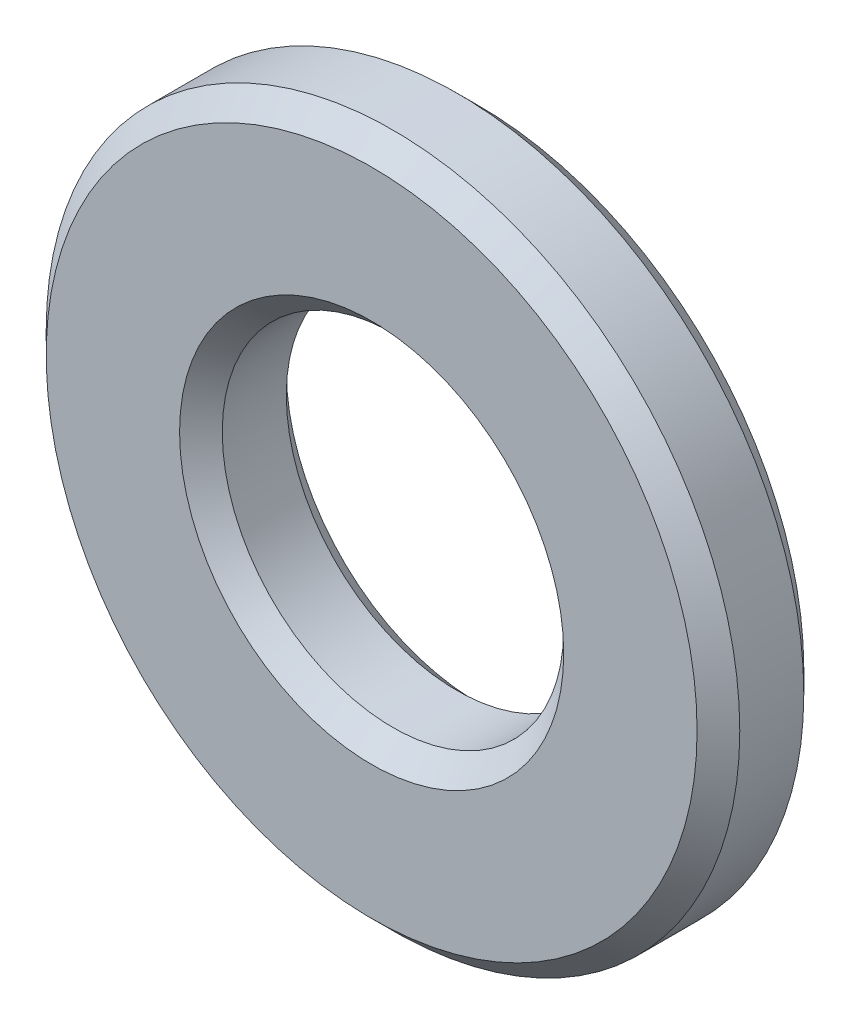
ISO-10303-21;
HEADER;
FILE_DESCRIPTION(('STEP AP214'),'2;1');
FILE_NAME('part.step','',(''),(''),'','','');
FILE_SCHEMA(('AUTOMOTIVE_DESIGN { 1 0 10303 214 1 1 1 1 }'));
ENDSEC;
DATA;
#1=APPLICATION_CONTEXT('core data for automotive mechanical design processes');
#2=APPLICATION_PROTOCOL_DEFINITION('international standard','automotive_design',2000,#1);
#3=PRODUCT_CONTEXT('',#1,'mechanical');
#4=PRODUCT('Part','Part','',(#3));
#5=PRODUCT_RELATED_PRODUCT_CATEGORY('part','',(#4));
#6=PRODUCT_DEFINITION_FORMATION('','',#4);
#7=PRODUCT_DEFINITION_CONTEXT('part definition',#1,'design');
#8=PRODUCT_DEFINITION('design','',#6,#7);
#9=PRODUCT_DEFINITION_SHAPE('','',#8);
#10=(LENGTH_UNIT() NAMED_UNIT(*) SI_UNIT(.MILLI.,.METRE.));
#11=(NAMED_UNIT(*) PLANE_ANGLE_UNIT() SI_UNIT($,.RADIAN.));
#12=(NAMED_UNIT(*) SI_UNIT($,.STERADIAN.) SOLID_ANGLE_UNIT());
#13=UNCERTAINTY_MEASURE_WITH_UNIT(LENGTH_MEASURE(1.E-05),#10,'distance_accuracy_value','');
#14=(GEOMETRIC_REPRESENTATION_CONTEXT(3) GLOBAL_UNCERTAINTY_ASSIGNED_CONTEXT((#13)) GLOBAL_UNIT_ASSIGNED_CONTEXT((#10,
#11,#12)) REPRESENTATION_CONTEXT('',''));
#15=CARTESIAN_POINT('',(0.,0.,0.));
#16=DIRECTION('',(0.,0.,1.));
#17=DIRECTION('',(1.,0.,0.));
#18=AXIS2_PLACEMENT_3D('',#15,#16,#17);
#19=CARTESIAN_POINT('',(0.,0.,10.));
#20=DIRECTION('',(0.,0.,1.));
#21=DIRECTION('',(1.,0.,0.));
#22=AXIS2_PLACEMENT_3D('',#19,#20,#21);
#23=PLANE('',#22);
#24=CARTESIAN_POINT('',(0.,0.,10.));
#25=DIRECTION('',(0.,0.,1.));
#26=DIRECTION('',(1.,0.,0.));
#27=AXIS2_PLACEMENT_3D('',#24,#25,#26);
#28=CIRCLE('',#27,18.);
#29=CARTESIAN_POINT('',(18.,0.,10.));
#30=VERTEX_POINT('',#29);
#31=EDGE_CURVE('E10',#30,#30,#28,.F.);
#32=ORIENTED_EDGE('',*,*,#31,.T.);
#33=EDGE_LOOP('',(#32));
#34=FACE_BOUND('',#33,.T.);
#35=CARTESIAN_POINT('',(0.,0.,10.));
#36=DIRECTION('',(0.,0.,1.));
#37=DIRECTION('',(1.,0.,0.));
#38=AXIS2_PLACEMENT_3D('',#35,#36,#37);
#39=CIRCLE('',#38,30.5);
#40=CARTESIAN_POINT('',(30.5,0.,10.));
#41=VERTEX_POINT('',#40);
#42=EDGE_CURVE('E41',#41,#41,#39,.T.);
#43=ORIENTED_EDGE('',*,*,#42,.T.);
#44=EDGE_LOOP('',(#43));
#45=FACE_BOUND('',#44,.T.);
#46=ADVANCED_FACE('F34',(#34,#45),#23,.T.);
#47=CARTESIAN_POINT('',(0.,0.,0.));
#48=DIRECTION('',(0.,0.,1.));
#49=DIRECTION('',(1.,0.,0.));
#50=AXIS2_PLACEMENT_3D('',#47,#48,#49);
#51=PLANE('',#50);
#52=CARTESIAN_POINT('',(0.,0.,0.));
#53=DIRECTION('',(0.,0.,1.));
#54=DIRECTION('',(1.,0.,0.));
#55=AXIS2_PLACEMENT_3D('',#52,#53,#54);
#56=CIRCLE('',#55,18.);
#57=CARTESIAN_POINT('',(18.,0.,0.));
#58=VERTEX_POINT('',#57);
#59=EDGE_CURVE('E60',#58,#58,#56,.T.);
#60=ORIENTED_EDGE('',*,*,#59,.T.);
#61=EDGE_LOOP('',(#60));
#62=FACE_BOUND('',#61,.T.);
#63=CARTESIAN_POINT('',(0.,0.,0.));
#64=DIRECTION('',(0.,0.,1.));
#65=DIRECTION('',(1.,0.,0.));
#66=AXIS2_PLACEMENT_3D('',#63,#64,#65);
#67=CIRCLE('',#66,30.5);
#68=CARTESIAN_POINT('',(30.5,0.,0.));
#69=VERTEX_POINT('',#68);
#70=EDGE_CURVE('E63',#69,#69,#67,.F.);
#71=ORIENTED_EDGE('',*,*,#70,.T.);
#72=EDGE_LOOP('',(#71));
#73=FACE_BOUND('',#72,.T.);
#74=ADVANCED_FACE('F67',(#62,#73),#51,.F.);
#75=CARTESIAN_POINT('',(0.,0.,10.));
#76=DIRECTION('',(0.,0.,-1.));
#77=DIRECTION('',(-1.,0.,0.));
#78=AXIS2_PLACEMENT_3D('',#75,#76,#77);
#79=CYLINDRICAL_SURFACE('',#78,32.5);
#80=CARTESIAN_POINT('',(0.,0.,2.00000000000001));
#81=DIRECTION('',(0.,0.,1.));
#82=DIRECTION('',(1.,0.,0.));
#83=AXIS2_PLACEMENT_3D('',#80,#81,#82);
#84=CIRCLE('',#83,32.5);
#85=CARTESIAN_POINT('',(32.5,0.,2.00000000000001));
#86=VERTEX_POINT('',#85);
#87=EDGE_CURVE('E45',#86,#86,#84,.T.);
#88=ORIENTED_EDGE('',*,*,#87,.T.);
#89=EDGE_LOOP('',(#88));
#90=FACE_BOUND('',#89,.T.);
#91=CARTESIAN_POINT('',(0.,0.,7.99999999999998));
#92=DIRECTION('',(0.,0.,1.));
#93=DIRECTION('',(1.,0.,0.));
#94=AXIS2_PLACEMENT_3D('',#91,#92,#93);
#95=CIRCLE('',#94,32.5);
#96=CARTESIAN_POINT('',(32.5,0.,7.99999999999998));
#97=VERTEX_POINT('',#96);
#98=EDGE_CURVE('E49',#97,#97,#95,.F.);
#99=ORIENTED_EDGE('',*,*,#98,.T.);
#100=EDGE_LOOP('',(#99));
#101=FACE_BOUND('',#100,.T.);
#102=ADVANCED_FACE('F77',(#90,#101),#79,.T.);
#103=CARTESIAN_POINT('',(0.,0.,10.));
#104=DIRECTION('',(0.,0.,-1.));
#105=DIRECTION('',(-1.,0.,0.));
#106=AXIS2_PLACEMENT_3D('',#103,#104,#105);
#107=CYLINDRICAL_SURFACE('',#106,16.);
#108=CARTESIAN_POINT('',(0.,0.,2.00000000000001));
#109=DIRECTION('',(0.,0.,1.));
#110=DIRECTION('',(1.,0.,0.));
#111=AXIS2_PLACEMENT_3D('',#108,#109,#110);
#112=CIRCLE('',#111,16.);
#113=CARTESIAN_POINT('',(16.,0.,2.00000000000001));
#114=VERTEX_POINT('',#113);
#115=EDGE_CURVE('E54',#114,#114,#112,.F.);
#116=ORIENTED_EDGE('',*,*,#115,.T.);
#117=EDGE_LOOP('',(#116));
#118=FACE_BOUND('',#117,.T.);
#119=CARTESIAN_POINT('',(0.,0.,8.));
#120=DIRECTION('',(0.,0.,1.));
#121=DIRECTION('',(1.,0.,0.));
#122=AXIS2_PLACEMENT_3D('',#119,#120,#121);
#123=CIRCLE('',#122,16.);
#124=CARTESIAN_POINT('',(16.,0.,8.));
#125=VERTEX_POINT('',#124);
#126=EDGE_CURVE('E57',#125,#125,#123,.T.);
#127=ORIENTED_EDGE('',*,*,#126,.T.);
#128=EDGE_LOOP('',(#127));
#129=FACE_BOUND('',#128,.T.);
#130=ADVANCED_FACE('F80',(#118,#129),#107,.F.);
#131=CARTESIAN_POINT('',(0.,0.,0.));
#132=DIRECTION('',(0.,0.,-1.));
#133=DIRECTION('',(-1.,0.,0.));
#134=AXIS2_PLACEMENT_3D('',#131,#132,#133);
#135=CONICAL_SURFACE('',#134,18.,0.785398163397447);
#136=ORIENTED_EDGE('',*,*,#115,.F.);
#137=EDGE_LOOP('',(#136));
#138=FACE_BOUND('',#137,.T.);
#139=ORIENTED_EDGE('',*,*,#59,.F.);
#140=EDGE_LOOP('',(#139));
#141=FACE_BOUND('',#140,.T.);
#142=ADVANCED_FACE('F73',(#138,#141),#135,.F.);
#143=CARTESIAN_POINT('',(0.,0.,2.00000000000001));
#144=DIRECTION('',(0.,0.,1.));
#145=DIRECTION('',(1.,0.,0.));
#146=AXIS2_PLACEMENT_3D('',#143,#144,#145);
#147=CONICAL_SURFACE('',#146,32.5,0.785398163397447);
#148=ORIENTED_EDGE('',*,*,#70,.F.);
#149=EDGE_LOOP('',(#148));
#150=FACE_BOUND('',#149,.T.);
#151=ORIENTED_EDGE('',*,*,#87,.F.);
#152=EDGE_LOOP('',(#151));
#153=FACE_BOUND('',#152,.T.);
#154=ADVANCED_FACE('F69',(#150,#153),#147,.T.);
#155=CARTESIAN_POINT('',(0.,0.,8.));
#156=DIRECTION('',(0.,0.,1.));
#157=DIRECTION('',(1.,0.,0.));
#158=AXIS2_PLACEMENT_3D('',#155,#156,#157);
#159=CONICAL_SURFACE('',#158,16.,0.785398163397449);
#160=ORIENTED_EDGE('',*,*,#31,.F.);
#161=EDGE_LOOP('',(#160));
#162=FACE_BOUND('',#161,.T.);
#163=ORIENTED_EDGE('',*,*,#126,.F.);
#164=EDGE_LOOP('',(#163));
#165=FACE_BOUND('',#164,.T.);
#166=ADVANCED_FACE('F72',(#162,#165),#159,.F.);
#167=CARTESIAN_POINT('',(0.,0.,10.));
#168=DIRECTION('',(0.,0.,-1.));
#169=DIRECTION('',(-1.,0.,0.));
#170=AXIS2_PLACEMENT_3D('',#167,#168,#169);
#171=CONICAL_SURFACE('',#170,30.5,0.785398163397445);
#172=ORIENTED_EDGE('',*,*,#98,.F.);
#173=EDGE_LOOP('',(#172));
#174=FACE_BOUND('',#173,.T.);
#175=ORIENTED_EDGE('',*,*,#42,.F.);
#176=EDGE_LOOP('',(#175));
#177=FACE_BOUND('',#176,.T.);
#178=ADVANCED_FACE('F36',(#174,#177),#171,.T.);
#179=CLOSED_SHELL('',(#46,#74,#102,#130,#142,#154,#166,#178));
#180=MANIFOLD_SOLID_BREP('B2',#179);
#181=ADVANCED_BREP_SHAPE_REPRESENTATION('',(#18,#180),#14);
#182=SHAPE_DEFINITION_REPRESENTATION(#9,#181);
ENDSEC;
END-ISO-10303-21;
